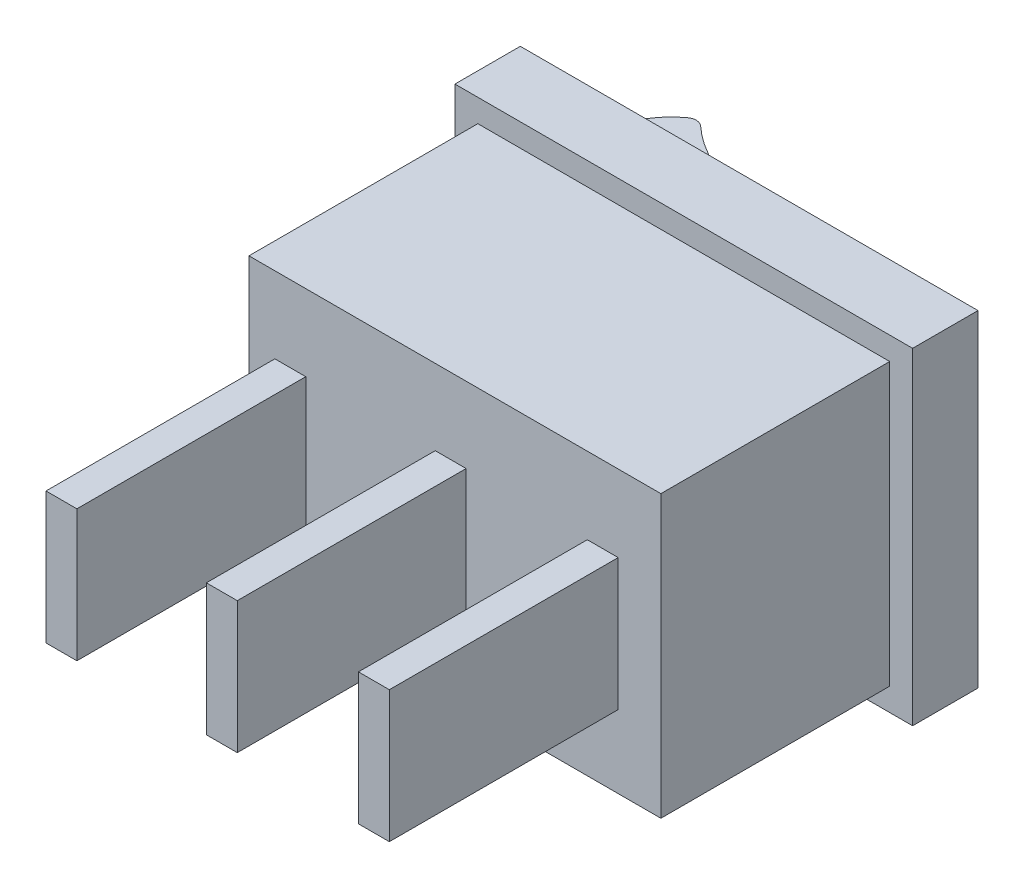
ISO-10303-21;
HEADER;
FILE_DESCRIPTION(('STEP AP214'),'2;1');
FILE_NAME('part.step','',(''),(''),'','','');
FILE_SCHEMA(('AUTOMOTIVE_DESIGN { 1 0 10303 214 1 1 1 1 }'));
ENDSEC;
DATA;
#1=APPLICATION_CONTEXT('core data for automotive mechanical design processes');
#2=APPLICATION_PROTOCOL_DEFINITION('international standard','automotive_design',2000,#1);
#3=PRODUCT_CONTEXT('',#1,'mechanical');
#4=PRODUCT('Part','Part','',(#3));
#5=PRODUCT_RELATED_PRODUCT_CATEGORY('part','',(#4));
#6=PRODUCT_DEFINITION_FORMATION('','',#4);
#7=PRODUCT_DEFINITION_CONTEXT('part definition',#1,'design');
#8=PRODUCT_DEFINITION('design','',#6,#7);
#9=PRODUCT_DEFINITION_SHAPE('','',#8);
#10=(LENGTH_UNIT() NAMED_UNIT(*) SI_UNIT(.MILLI.,.METRE.));
#11=(NAMED_UNIT(*) PLANE_ANGLE_UNIT() SI_UNIT($,.RADIAN.));
#12=(NAMED_UNIT(*) SI_UNIT($,.STERADIAN.) SOLID_ANGLE_UNIT());
#13=UNCERTAINTY_MEASURE_WITH_UNIT(LENGTH_MEASURE(1.E-05),#10,'distance_accuracy_value','');
#14=(GEOMETRIC_REPRESENTATION_CONTEXT(3) GLOBAL_UNCERTAINTY_ASSIGNED_CONTEXT((#13)) GLOBAL_UNIT_ASSIGNED_CONTEXT((#10,
#11,#12)) REPRESENTATION_CONTEXT('',''));
#15=CARTESIAN_POINT('',(0.,0.,0.));
#16=DIRECTION('',(0.,0.,1.));
#17=DIRECTION('',(1.,0.,0.));
#18=AXIS2_PLACEMENT_3D('',#15,#16,#17);
#19=CARTESIAN_POINT('',(0.,0.,13.5));
#20=DIRECTION('',(0.,0.,1.));
#21=DIRECTION('',(1.,0.,0.));
#22=AXIS2_PLACEMENT_3D('',#19,#20,#21);
#23=PLANE('',#22);
#24=DIRECTION('',(0.,1.,0.));
#25=VECTOR('',#24,1.);
#26=CARTESIAN_POINT('',(9.45,6.45,13.5));
#27=LINE('',#26,#25);
#28=CARTESIAN_POINT('',(9.45,-6.45,13.5));
#29=VERTEX_POINT('',#28);
#30=CARTESIAN_POINT('',(9.45,6.45,13.5));
#31=VERTEX_POINT('',#30);
#32=EDGE_CURVE('E420',#29,#31,#27,.T.);
#33=ORIENTED_EDGE('',*,*,#32,.T.);
#34=DIRECTION('',(-1.,0.,0.));
#35=VECTOR('',#34,1.);
#36=CARTESIAN_POINT('',(-9.45,6.45,13.5));
#37=LINE('',#36,#35);
#38=CARTESIAN_POINT('',(-9.45,6.45,13.5));
#39=VERTEX_POINT('',#38);
#40=EDGE_CURVE('E415',#31,#39,#37,.T.);
#41=ORIENTED_EDGE('',*,*,#40,.T.);
#42=DIRECTION('',(0.,-1.,0.));
#43=VECTOR('',#42,1.);
#44=CARTESIAN_POINT('',(-9.45,6.45,13.5));
#45=LINE('',#44,#43);
#46=CARTESIAN_POINT('',(-9.45,-6.45,13.5));
#47=VERTEX_POINT('',#46);
#48=EDGE_CURVE('E432',#39,#47,#45,.T.);
#49=ORIENTED_EDGE('',*,*,#48,.T.);
#50=DIRECTION('',(1.,0.,0.));
#51=VECTOR('',#50,1.);
#52=CARTESIAN_POINT('',(-9.45,-6.45,13.5));
#53=LINE('',#52,#51);
#54=EDGE_CURVE('E435',#47,#29,#53,.T.);
#55=ORIENTED_EDGE('',*,*,#54,.T.);
#56=EDGE_LOOP('',(#33,#41,#49,#55));
#57=FACE_BOUND('',#56,.T.);
#58=DIRECTION('',(1.,0.,0.));
#59=VECTOR('',#58,1.);
#60=CARTESIAN_POINT('',(-8.26175147034112,-3.08976071248527,13.5));
#61=LINE('',#60,#59);
#62=CARTESIAN_POINT('',(-8.26175147034112,-3.08976071248527,13.5));
#63=VERTEX_POINT('',#62);
#64=CARTESIAN_POINT('',(-6.84374534625367,-3.08976071248527,13.5));
#65=VERTEX_POINT('',#64);
#66=EDGE_CURVE('E264',#63,#65,#61,.T.);
#67=ORIENTED_EDGE('',*,*,#66,.F.);
#68=DIRECTION('',(0.,-1.,0.));
#69=VECTOR('',#68,1.);
#70=CARTESIAN_POINT('',(-8.26175147034112,2.95020930285563,13.5));
#71=LINE('',#70,#69);
#72=CARTESIAN_POINT('',(-8.26175147034112,2.95020930285563,13.5));
#73=VERTEX_POINT('',#72);
#74=EDGE_CURVE('E250',#73,#63,#71,.T.);
#75=ORIENTED_EDGE('',*,*,#74,.F.);
#76=DIRECTION('',(-1.,0.,0.));
#77=VECTOR('',#76,1.);
#78=CARTESIAN_POINT('',(-8.26175147034112,2.95020930285563,13.5));
#79=LINE('',#78,#77);
#80=CARTESIAN_POINT('',(-6.84374534625367,2.95020930285563,13.5));
#81=VERTEX_POINT('',#80);
#82=EDGE_CURVE('E255',#81,#73,#79,.T.);
#83=ORIENTED_EDGE('',*,*,#82,.F.);
#84=DIRECTION('',(0.,1.,0.));
#85=VECTOR('',#84,1.);
#86=CARTESIAN_POINT('',(-6.84374534625367,2.95020930285563,13.5));
#87=LINE('',#86,#85);
#88=EDGE_CURVE('E266',#65,#81,#87,.T.);
#89=ORIENTED_EDGE('',*,*,#88,.F.);
#90=EDGE_LOOP('',(#67,#75,#83,#89));
#91=FACE_BOUND('',#90,.T.);
#92=DIRECTION('',(1.,0.,0.));
#93=VECTOR('',#92,1.);
#94=CARTESIAN_POINT('',(-0.903046005339907,-3.05990795197817,13.5));
#95=LINE('',#94,#93);
#96=CARTESIAN_POINT('',(-0.903046005339907,-3.05990795197817,13.5));
#97=VERTEX_POINT('',#96);
#98=CARTESIAN_POINT('',(0.514960118747548,-3.05990795197817,13.5));
#99=VERTEX_POINT('',#98);
#100=EDGE_CURVE('E222',#97,#99,#95,.T.);
#101=ORIENTED_EDGE('',*,*,#100,.F.);
#102=DIRECTION('',(0.,-1.,0.));
#103=VECTOR('',#102,1.);
#104=CARTESIAN_POINT('',(-0.903046005339908,2.98006206336274,13.5));
#105=LINE('',#104,#103);
#106=CARTESIAN_POINT('',(-0.903046005339908,2.98006206336274,13.5));
#107=VERTEX_POINT('',#106);
#108=EDGE_CURVE('E219',#107,#97,#105,.T.);
#109=ORIENTED_EDGE('',*,*,#108,.F.);
#110=DIRECTION('',(-1.,0.,0.));
#111=VECTOR('',#110,1.);
#112=CARTESIAN_POINT('',(-0.903046005339908,2.98006206336274,13.5));
#113=LINE('',#112,#111);
#114=CARTESIAN_POINT('',(0.514960118747548,2.98006206336274,13.5));
#115=VERTEX_POINT('',#114);
#116=EDGE_CURVE('E231',#115,#107,#113,.T.);
#117=ORIENTED_EDGE('',*,*,#116,.F.);
#118=DIRECTION('',(0.,1.,0.));
#119=VECTOR('',#118,1.);
#120=CARTESIAN_POINT('',(0.514960118747548,2.98006206336274,13.5));
#121=LINE('',#120,#119);
#122=EDGE_CURVE('E239',#99,#115,#121,.T.);
#123=ORIENTED_EDGE('',*,*,#122,.F.);
#124=EDGE_LOOP('',(#101,#109,#117,#123));
#125=FACE_BOUND('',#124,.T.);
#126=DIRECTION('',(1.,0.,0.));
#127=VECTOR('',#126,1.);
#128=CARTESIAN_POINT('',(6.07376020752396,-3.10975909773958,13.5));
#129=LINE('',#128,#127);
#130=CARTESIAN_POINT('',(6.07376020752396,-3.10975909773958,13.5));
#131=VERTEX_POINT('',#130);
#132=CARTESIAN_POINT('',(7.49176633161142,-3.10975909773958,13.5));
#133=VERTEX_POINT('',#132);
#134=EDGE_CURVE('E479',#131,#133,#129,.T.);
#135=ORIENTED_EDGE('',*,*,#134,.F.);
#136=DIRECTION('',(0.,-1.,0.));
#137=VECTOR('',#136,1.);
#138=CARTESIAN_POINT('',(6.07376020752396,2.93021091760132,13.5));
#139=LINE('',#138,#137);
#140=CARTESIAN_POINT('',(6.07376020752396,2.93021091760132,13.5));
#141=VERTEX_POINT('',#140);
#142=EDGE_CURVE('E217',#141,#131,#139,.T.);
#143=ORIENTED_EDGE('',*,*,#142,.F.);
#144=DIRECTION('',(-1.,0.,0.));
#145=VECTOR('',#144,1.);
#146=CARTESIAN_POINT('',(6.07376020752396,2.93021091760132,13.5));
#147=LINE('',#146,#145);
#148=CARTESIAN_POINT('',(7.49176633161142,2.93021091760132,13.5));
#149=VERTEX_POINT('',#148);
#150=EDGE_CURVE('E213',#149,#141,#147,.T.);
#151=ORIENTED_EDGE('',*,*,#150,.F.);
#152=DIRECTION('',(0.,1.,0.));
#153=VECTOR('',#152,1.);
#154=CARTESIAN_POINT('',(7.49176633161142,2.93021091760132,13.5));
#155=LINE('',#154,#153);
#156=EDGE_CURVE('E481',#133,#149,#155,.T.);
#157=ORIENTED_EDGE('',*,*,#156,.F.);
#158=EDGE_LOOP('',(#135,#143,#151,#157));
#159=FACE_BOUND('',#158,.T.);
#160=ADVANCED_FACE('F33',(#57,#91,#125,#159),#23,.T.);
#161=CARTESIAN_POINT('',(10.5,7.5,13.5));
#162=DIRECTION('',(-1.,0.,0.));
#163=DIRECTION('',(0.,0.,1.));
#164=AXIS2_PLACEMENT_3D('',#161,#162,#163);
#165=PLANE('',#164);
#166=DIRECTION('',(0.,1.,0.));
#167=VECTOR('',#166,1.);
#168=CARTESIAN_POINT('',(10.5,7.5,3.));
#169=LINE('',#168,#167);
#170=CARTESIAN_POINT('',(10.5,-7.5,3.));
#171=VERTEX_POINT('',#170);
#172=CARTESIAN_POINT('',(10.5,7.5,3.));
#173=VERTEX_POINT('',#172);
#174=EDGE_CURVE('E348',#171,#173,#169,.T.);
#175=ORIENTED_EDGE('',*,*,#174,.F.);
#176=DIRECTION('',(0.,0.,-1.));
#177=VECTOR('',#176,1.);
#178=CARTESIAN_POINT('',(10.5,-7.5,13.5));
#179=LINE('',#178,#177);
#180=CARTESIAN_POINT('',(10.5,-7.5,0.));
#181=VERTEX_POINT('',#180);
#182=EDGE_CURVE('E351',#171,#181,#179,.T.);
#183=ORIENTED_EDGE('',*,*,#182,.T.);
#184=DIRECTION('',(0.,1.,0.));
#185=VECTOR('',#184,1.);
#186=CARTESIAN_POINT('',(10.5,7.5,0.));
#187=LINE('',#186,#185);
#188=CARTESIAN_POINT('',(10.5,7.5,0.));
#189=VERTEX_POINT('',#188);
#190=EDGE_CURVE('E452',#181,#189,#187,.T.);
#191=ORIENTED_EDGE('',*,*,#190,.T.);
#192=DIRECTION('',(0.,0.,-1.));
#193=VECTOR('',#192,1.);
#194=CARTESIAN_POINT('',(10.5,7.5,13.5));
#195=LINE('',#194,#193);
#196=EDGE_CURVE('E353',#173,#189,#195,.T.);
#197=ORIENTED_EDGE('',*,*,#196,.F.);
#198=EDGE_LOOP('',(#175,#183,#191,#197));
#199=FACE_BOUND('',#198,.T.);
#200=ADVANCED_FACE('F326',(#199),#165,.F.);
#201=CARTESIAN_POINT('',(-10.5,7.5,13.5));
#202=DIRECTION('',(0.,-1.,0.));
#203=DIRECTION('',(0.,0.,-1.));
#204=AXIS2_PLACEMENT_3D('',#201,#202,#203);
#205=PLANE('',#204);
#206=DIRECTION('',(-1.,0.,0.));
#207=VECTOR('',#206,1.);
#208=CARTESIAN_POINT('',(-10.5,7.5,3.));
#209=LINE('',#208,#207);
#210=CARTESIAN_POINT('',(-10.5,7.5,3.));
#211=VERTEX_POINT('',#210);
#212=EDGE_CURVE('E356',#173,#211,#209,.T.);
#213=ORIENTED_EDGE('',*,*,#212,.F.);
#214=ORIENTED_EDGE('',*,*,#196,.T.);
#215=DIRECTION('',(-1.,0.,0.));
#216=VECTOR('',#215,1.);
#217=CARTESIAN_POINT('',(-10.5,7.5,0.));
#218=LINE('',#217,#216);
#219=CARTESIAN_POINT('',(-10.5,7.5,0.));
#220=VERTEX_POINT('',#219);
#221=EDGE_CURVE('E454',#189,#220,#218,.T.);
#222=ORIENTED_EDGE('',*,*,#221,.T.);
#223=DIRECTION('',(0.,0.,-1.));
#224=VECTOR('',#223,1.);
#225=CARTESIAN_POINT('',(-10.5,7.5,13.5));
#226=LINE('',#225,#224);
#227=EDGE_CURVE('E366',#211,#220,#226,.T.);
#228=ORIENTED_EDGE('',*,*,#227,.F.);
#229=EDGE_LOOP('',(#213,#214,#222,#228));
#230=FACE_BOUND('',#229,.T.);
#231=ADVANCED_FACE('F338',(#230),#205,.F.);
#232=CARTESIAN_POINT('',(-10.5,7.5,13.5));
#233=DIRECTION('',(1.,0.,0.));
#234=DIRECTION('',(0.,0.,-1.));
#235=AXIS2_PLACEMENT_3D('',#232,#233,#234);
#236=PLANE('',#235);
#237=DIRECTION('',(0.,-1.,0.));
#238=VECTOR('',#237,1.);
#239=CARTESIAN_POINT('',(-10.5,7.5,3.));
#240=LINE('',#239,#238);
#241=CARTESIAN_POINT('',(-10.5,-7.5,3.));
#242=VERTEX_POINT('',#241);
#243=EDGE_CURVE('E442',#211,#242,#240,.T.);
#244=ORIENTED_EDGE('',*,*,#243,.F.);
#245=ORIENTED_EDGE('',*,*,#227,.T.);
#246=DIRECTION('',(0.,-1.,0.));
#247=VECTOR('',#246,1.);
#248=CARTESIAN_POINT('',(-10.5,7.5,0.));
#249=LINE('',#248,#247);
#250=CARTESIAN_POINT('',(-10.5,-7.5,0.));
#251=VERTEX_POINT('',#250);
#252=EDGE_CURVE('E368',#220,#251,#249,.T.);
#253=ORIENTED_EDGE('',*,*,#252,.T.);
#254=DIRECTION('',(0.,0.,-1.));
#255=VECTOR('',#254,1.);
#256=CARTESIAN_POINT('',(-10.5,-7.5,13.5));
#257=LINE('',#256,#255);
#258=EDGE_CURVE('E364',#242,#251,#257,.T.);
#259=ORIENTED_EDGE('',*,*,#258,.F.);
#260=EDGE_LOOP('',(#244,#245,#253,#259));
#261=FACE_BOUND('',#260,.T.);
#262=ADVANCED_FACE('F334',(#261),#236,.F.);
#263=CARTESIAN_POINT('',(-10.5,-7.5,13.5));
#264=DIRECTION('',(0.,1.,0.));
#265=DIRECTION('',(0.,0.,1.));
#266=AXIS2_PLACEMENT_3D('',#263,#264,#265);
#267=PLANE('',#266);
#268=DIRECTION('',(1.,0.,0.));
#269=VECTOR('',#268,1.);
#270=CARTESIAN_POINT('',(-10.5,-7.5,3.));
#271=LINE('',#270,#269);
#272=EDGE_CURVE('E357',#242,#171,#271,.T.);
#273=ORIENTED_EDGE('',*,*,#272,.F.);
#274=ORIENTED_EDGE('',*,*,#258,.T.);
#275=DIRECTION('',(1.,0.,0.));
#276=VECTOR('',#275,1.);
#277=CARTESIAN_POINT('',(-10.5,-7.5,0.));
#278=LINE('',#277,#276);
#279=EDGE_CURVE('E362',#251,#181,#278,.T.);
#280=ORIENTED_EDGE('',*,*,#279,.T.);
#281=ORIENTED_EDGE('',*,*,#182,.F.);
#282=EDGE_LOOP('',(#273,#274,#280,#281));
#283=FACE_BOUND('',#282,.T.);
#284=ADVANCED_FACE('F330',(#283),#267,.F.);
#285=CARTESIAN_POINT('',(0.,0.,0.));
#286=DIRECTION('',(0.,0.,1.));
#287=DIRECTION('',(1.,0.,0.));
#288=AXIS2_PLACEMENT_3D('',#285,#286,#287);
#289=PLANE('',#288);
#290=DIRECTION('',(0.,-1.,0.));
#291=VECTOR('',#290,1.);
#292=CARTESIAN_POINT('',(-7.96352239287512,5.25,0.));
#293=LINE('',#292,#291);
#294=CARTESIAN_POINT('',(-7.96352239287512,5.25,0.));
#295=VERTEX_POINT('',#294);
#296=CARTESIAN_POINT('',(-7.96352239287512,-5.25,0.));
#297=VERTEX_POINT('',#296);
#298=EDGE_CURVE('E413',#295,#297,#293,.T.);
#299=ORIENTED_EDGE('',*,*,#298,.T.);
#300=DIRECTION('',(1.,0.,0.));
#301=VECTOR('',#300,1.);
#302=CARTESIAN_POINT('',(7.03928092757528,-5.25,0.));
#303=LINE('',#302,#301);
#304=CARTESIAN_POINT('',(7.03928092757528,-5.25,0.));
#305=VERTEX_POINT('',#304);
#306=EDGE_CURVE('E287',#297,#305,#303,.T.);
#307=ORIENTED_EDGE('',*,*,#306,.T.);
#308=DIRECTION('',(0.,-1.,0.));
#309=VECTOR('',#308,1.);
#310=CARTESIAN_POINT('',(7.03928092757528,5.25,0.));
#311=LINE('',#310,#309);
#312=CARTESIAN_POINT('',(7.03928092757528,5.25,0.));
#313=VERTEX_POINT('',#312);
#314=EDGE_CURVE('E411',#313,#305,#311,.T.);
#315=ORIENTED_EDGE('',*,*,#314,.F.);
#316=DIRECTION('',(1.,0.,0.));
#317=VECTOR('',#316,1.);
#318=CARTESIAN_POINT('',(7.03928092757528,5.25,0.));
#319=LINE('',#318,#317);
#320=EDGE_CURVE('E389',#295,#313,#319,.T.);
#321=ORIENTED_EDGE('',*,*,#320,.F.);
#322=EDGE_LOOP('',(#299,#307,#315,#321));
#323=FACE_BOUND('',#322,.T.);
#324=ORIENTED_EDGE('',*,*,#190,.F.);
#325=ORIENTED_EDGE('',*,*,#279,.F.);
#326=ORIENTED_EDGE('',*,*,#252,.F.);
#327=ORIENTED_EDGE('',*,*,#221,.F.);
#328=EDGE_LOOP('',(#324,#325,#326,#327));
#329=FACE_BOUND('',#328,.T.);
#330=ADVANCED_FACE('F322',(#323,#329),#289,.F.);
#331=CARTESIAN_POINT('',(0.,0.,3.));
#332=DIRECTION('',(0.,0.,1.));
#333=DIRECTION('',(1.,0.,0.));
#334=AXIS2_PLACEMENT_3D('',#331,#332,#333);
#335=PLANE('',#334);
#336=DIRECTION('',(0.,1.,0.));
#337=VECTOR('',#336,1.);
#338=CARTESIAN_POINT('',(9.45,6.45,3.));
#339=LINE('',#338,#337);
#340=CARTESIAN_POINT('',(9.45,-6.45,3.));
#341=VERTEX_POINT('',#340);
#342=CARTESIAN_POINT('',(9.45,6.45,3.));
#343=VERTEX_POINT('',#342);
#344=EDGE_CURVE('E426',#341,#343,#339,.T.);
#345=ORIENTED_EDGE('',*,*,#344,.F.);
#346=DIRECTION('',(1.,0.,0.));
#347=VECTOR('',#346,1.);
#348=CARTESIAN_POINT('',(-9.45,-6.45,3.));
#349=LINE('',#348,#347);
#350=CARTESIAN_POINT('',(-9.45,-6.45,3.));
#351=VERTEX_POINT('',#350);
#352=EDGE_CURVE('E423',#351,#341,#349,.T.);
#353=ORIENTED_EDGE('',*,*,#352,.F.);
#354=DIRECTION('',(0.,-1.,0.));
#355=VECTOR('',#354,1.);
#356=CARTESIAN_POINT('',(-9.45,6.45,3.));
#357=LINE('',#356,#355);
#358=CARTESIAN_POINT('',(-9.45,6.45,3.));
#359=VERTEX_POINT('',#358);
#360=EDGE_CURVE('E419',#359,#351,#357,.T.);
#361=ORIENTED_EDGE('',*,*,#360,.F.);
#362=DIRECTION('',(-1.,0.,0.));
#363=VECTOR('',#362,1.);
#364=CARTESIAN_POINT('',(-9.45,6.45,3.));
#365=LINE('',#364,#363);
#366=EDGE_CURVE('E416',#343,#359,#365,.T.);
#367=ORIENTED_EDGE('',*,*,#366,.F.);
#368=EDGE_LOOP('',(#345,#353,#361,#367));
#369=FACE_BOUND('',#368,.T.);
#370=ORIENTED_EDGE('',*,*,#243,.T.);
#371=ORIENTED_EDGE('',*,*,#272,.T.);
#372=ORIENTED_EDGE('',*,*,#174,.T.);
#373=ORIENTED_EDGE('',*,*,#212,.T.);
#374=EDGE_LOOP('',(#370,#371,#372,#373));
#375=FACE_BOUND('',#374,.T.);
#376=ADVANCED_FACE('F318',(#369,#375),#335,.T.);
#377=CARTESIAN_POINT('',(-9.45,6.45,3.));
#378=DIRECTION('',(0.,1.,0.));
#379=DIRECTION('',(0.,0.,1.));
#380=AXIS2_PLACEMENT_3D('',#377,#378,#379);
#381=PLANE('',#380);
#382=ORIENTED_EDGE('',*,*,#40,.F.);
#383=DIRECTION('',(0.,0.,1.));
#384=VECTOR('',#383,1.);
#385=CARTESIAN_POINT('',(9.45,6.45,3.));
#386=LINE('',#385,#384);
#387=EDGE_CURVE('E440',#343,#31,#386,.T.);
#388=ORIENTED_EDGE('',*,*,#387,.F.);
#389=ORIENTED_EDGE('',*,*,#366,.T.);
#390=DIRECTION('',(0.,0.,1.));
#391=VECTOR('',#390,1.);
#392=CARTESIAN_POINT('',(-9.45,6.45,3.));
#393=LINE('',#392,#391);
#394=EDGE_CURVE('E429',#359,#39,#393,.T.);
#395=ORIENTED_EDGE('',*,*,#394,.T.);
#396=EDGE_LOOP('',(#382,#388,#389,#395));
#397=FACE_BOUND('',#396,.T.);
#398=ADVANCED_FACE('F308',(#397),#381,.T.);
#399=CARTESIAN_POINT('',(9.45,6.45,3.));
#400=DIRECTION('',(1.,0.,0.));
#401=DIRECTION('',(0.,0.,-1.));
#402=AXIS2_PLACEMENT_3D('',#399,#400,#401);
#403=PLANE('',#402);
#404=ORIENTED_EDGE('',*,*,#32,.F.);
#405=DIRECTION('',(0.,0.,1.));
#406=VECTOR('',#405,1.);
#407=CARTESIAN_POINT('',(9.45,-6.45,3.));
#408=LINE('',#407,#406);
#409=EDGE_CURVE('E443',#341,#29,#408,.T.);
#410=ORIENTED_EDGE('',*,*,#409,.F.);
#411=ORIENTED_EDGE('',*,*,#344,.T.);
#412=ORIENTED_EDGE('',*,*,#387,.T.);
#413=EDGE_LOOP('',(#404,#410,#411,#412));
#414=FACE_BOUND('',#413,.T.);
#415=ADVANCED_FACE('F304',(#414),#403,.T.);
#416=CARTESIAN_POINT('',(-9.45,-6.45,3.));
#417=DIRECTION('',(0.,-1.,0.));
#418=DIRECTION('',(0.,0.,-1.));
#419=AXIS2_PLACEMENT_3D('',#416,#417,#418);
#420=PLANE('',#419);
#421=ORIENTED_EDGE('',*,*,#54,.F.);
#422=DIRECTION('',(0.,0.,1.));
#423=VECTOR('',#422,1.);
#424=CARTESIAN_POINT('',(-9.45,-6.45,3.));
#425=LINE('',#424,#423);
#426=EDGE_CURVE('E445',#351,#47,#425,.T.);
#427=ORIENTED_EDGE('',*,*,#426,.F.);
#428=ORIENTED_EDGE('',*,*,#352,.T.);
#429=ORIENTED_EDGE('',*,*,#409,.T.);
#430=EDGE_LOOP('',(#421,#427,#428,#429));
#431=FACE_BOUND('',#430,.T.);
#432=ADVANCED_FACE('F307',(#431),#420,.T.);
#433=CARTESIAN_POINT('',(-9.45,6.45,3.));
#434=DIRECTION('',(-1.,0.,0.));
#435=DIRECTION('',(0.,0.,1.));
#436=AXIS2_PLACEMENT_3D('',#433,#434,#435);
#437=PLANE('',#436);
#438=ORIENTED_EDGE('',*,*,#48,.F.);
#439=ORIENTED_EDGE('',*,*,#394,.F.);
#440=ORIENTED_EDGE('',*,*,#360,.T.);
#441=ORIENTED_EDGE('',*,*,#426,.T.);
#442=EDGE_LOOP('',(#438,#439,#440,#441));
#443=FACE_BOUND('',#442,.T.);
#444=ADVANCED_FACE('F301',(#443),#437,.T.);
#445=CARTESIAN_POINT('',(7.03928092757528,5.25,0.));
#446=CARTESIAN_POINT('',(4.22402006114333,5.25,-0.0692176151443661));
#447=CARTESIAN_POINT('',(-0.214677684163908,5.25,-0.666830620425082));
#448=CARTESIAN_POINT('',(-4.50292106901317,5.25,-2.20467774432923));
#449=CARTESIAN_POINT('',(-5.70665369853801,5.25,-3.48113808099488));
#450=B_SPLINE_CURVE_WITH_KNOTS('',3,(#445,#446,#447,#448,#449),.UNSPECIFIED.,.F.,.F.,(4,1,4),
(0.,0.624058329896572,1.),.UNSPECIFIED.);
#451=DIRECTION('',(0.,-1.,0.));
#452=VECTOR('',#451,1.);
#453=SURFACE_OF_LINEAR_EXTRUSION('',#450,#452);
#454=CARTESIAN_POINT('',(7.03928092757528,-5.25,0.));
#455=CARTESIAN_POINT('',(4.22402006114333,-5.25,-0.0692176151443661));
#456=CARTESIAN_POINT('',(-0.214677684163908,-5.25,-0.666830620425082));
#457=CARTESIAN_POINT('',(-4.50292106901317,-5.25,-2.20467774432923));
#458=CARTESIAN_POINT('',(-5.70665369853801,-5.25,-3.48113808099488));
#459=B_SPLINE_CURVE_WITH_KNOTS('',3,(#454,#455,#456,#457,#458),.UNSPECIFIED.,.F.,.F.,(4,1,4),
(0.,0.624058329896572,1.),.UNSPECIFIED.);
#460=CARTESIAN_POINT('',(-5.43822065057914,-5.25,-3.21399688626997));
#461=VERTEX_POINT('',#460);
#462=EDGE_CURVE('E279',#305,#461,#459,.T.);
#463=ORIENTED_EDGE('',*,*,#462,.T.);
#464=DIRECTION('',(0.,-1.,0.));
#465=VECTOR('',#464,1.);
#466=CARTESIAN_POINT('',(-5.43822065057797,-5.25,-3.21399688626887));
#467=LINE('',#466,#465);
#468=CARTESIAN_POINT('',(-5.43822065057914,5.25,-3.21399688626997));
#469=VERTEX_POINT('',#468);
#470=EDGE_CURVE('E41',#461,#469,#467,.F.);
#471=ORIENTED_EDGE('',*,*,#470,.T.);
#472=EDGE_CURVE('E280',#313,#469,#450,.T.);
#473=ORIENTED_EDGE('',*,*,#472,.F.);
#474=ORIENTED_EDGE('',*,*,#314,.T.);
#475=EDGE_LOOP('',(#463,#471,#473,#474));
#476=FACE_BOUND('',#475,.T.);
#477=ADVANCED_FACE('F296',(#476),#453,.F.);
#478=CARTESIAN_POINT('',(-5.70665369853801,5.25,-3.48113808099488));
#479=CARTESIAN_POINT('',(-7.05794291166516,5.25,-2.76318769823294));
#480=CARTESIAN_POINT('',(-7.48846721714369,5.25,-1.30741620410435));
#481=CARTESIAN_POINT('',(-7.96352239287512,5.25,0.));
#482=B_SPLINE_CURVE_WITH_KNOTS('',3,(#478,#479,#480,#481),.UNSPECIFIED.,.F.,.F.,(4,4),(0.,1.),.UNSPECIFIED.);
#483=DIRECTION('',(0.,-1.,0.));
#484=VECTOR('',#483,1.);
#485=SURFACE_OF_LINEAR_EXTRUSION('',#482,#484);
#486=CARTESIAN_POINT('',(-6.07164005568649,5.25,-3.25445208079002));
#487=VERTEX_POINT('',#486);
#488=EDGE_CURVE('E286',#487,#295,#482,.T.);
#489=ORIENTED_EDGE('',*,*,#488,.F.);
#490=DIRECTION('',(0.,-1.,0.));
#491=VECTOR('',#490,1.);
#492=CARTESIAN_POINT('',(-6.07164005568649,5.25,-3.25445208079002));
#493=LINE('',#492,#491);
#494=CARTESIAN_POINT('',(-6.07164005568649,-5.25,-3.25445208079002));
#495=VERTEX_POINT('',#494);
#496=EDGE_CURVE('E374',#487,#495,#493,.T.);
#497=ORIENTED_EDGE('',*,*,#496,.T.);
#498=CARTESIAN_POINT('',(-5.70665369853801,-5.25,-3.48113808099488));
#499=CARTESIAN_POINT('',(-7.05794291166516,-5.25,-2.76318769823294));
#500=CARTESIAN_POINT('',(-7.48846721714369,-5.25,-1.30741620410435));
#501=CARTESIAN_POINT('',(-7.96352239287512,-5.25,0.));
#502=B_SPLINE_CURVE_WITH_KNOTS('',3,(#498,#499,#500,#501),.UNSPECIFIED.,.F.,.F.,(4,4),(0.,1.),.UNSPECIFIED.);
#503=EDGE_CURVE('E394',#495,#297,#502,.T.);
#504=ORIENTED_EDGE('',*,*,#503,.T.);
#505=ORIENTED_EDGE('',*,*,#298,.F.);
#506=EDGE_LOOP('',(#489,#497,#504,#505));
#507=FACE_BOUND('',#506,.T.);
#508=ADVANCED_FACE('F300',(#507),#485,.F.);
#509=CARTESIAN_POINT('',(0.366471543100387,5.25,-0.783408414690507));
#510=DIRECTION('',(0.,1.,0.));
#511=DIRECTION('',(0.,0.,1.));
#512=AXIS2_PLACEMENT_3D('',#509,#510,#511);
#513=PLANE('',#512);
#514=ORIENTED_EDGE('',*,*,#472,.T.);
#515=CARTESIAN_POINT('',(-5.77955716685518,5.25,-2.84863489774825));
#516=DIRECTION('',(0.,1.,0.));
#517=DIRECTION('',(0.,0.,1.));
#518=AXIS2_PLACEMENT_3D('',#515,#516,#517);
#519=CIRCLE('',#518,0.5);
#520=EDGE_CURVE('E11',#469,#487,#519,.T.);
#521=ORIENTED_EDGE('',*,*,#520,.T.);
#522=ORIENTED_EDGE('',*,*,#488,.T.);
#523=ORIENTED_EDGE('',*,*,#320,.T.);
#524=EDGE_LOOP('',(#514,#521,#522,#523));
#525=FACE_BOUND('',#524,.T.);
#526=ADVANCED_FACE('F386',(#525),#513,.T.);
#527=CARTESIAN_POINT('',(0.366471543100387,-5.25,-0.783408414690507));
#528=DIRECTION('',(0.,1.,0.));
#529=DIRECTION('',(0.,0.,1.));
#530=AXIS2_PLACEMENT_3D('',#527,#528,#529);
#531=PLANE('',#530);
#532=ORIENTED_EDGE('',*,*,#503,.F.);
#533=CARTESIAN_POINT('',(-5.77955716685518,-5.25,-2.84863489774825));
#534=DIRECTION('',(0.,1.,0.));
#535=DIRECTION('',(0.,0.,1.));
#536=AXIS2_PLACEMENT_3D('',#533,#534,#535);
#537=CIRCLE('',#536,0.5);
#538=EDGE_CURVE('E377',#495,#461,#537,.F.);
#539=ORIENTED_EDGE('',*,*,#538,.T.);
#540=ORIENTED_EDGE('',*,*,#462,.F.);
#541=ORIENTED_EDGE('',*,*,#306,.F.);
#542=EDGE_LOOP('',(#532,#539,#540,#541));
#543=FACE_BOUND('',#542,.T.);
#544=ADVANCED_FACE('F397',(#543),#531,.F.);
#545=CARTESIAN_POINT('',(-5.77955716685518,0.,-2.84863489774825));
#546=DIRECTION('',(0.,-1.,0.));
#547=DIRECTION('',(0.,0.,-1.));
#548=AXIS2_PLACEMENT_3D('',#545,#546,#547);
#549=CYLINDRICAL_SURFACE('',#548,0.5);
#550=ORIENTED_EDGE('',*,*,#520,.F.);
#551=ORIENTED_EDGE('',*,*,#470,.F.);
#552=ORIENTED_EDGE('',*,*,#538,.F.);
#553=ORIENTED_EDGE('',*,*,#496,.F.);
#554=EDGE_LOOP('',(#550,#551,#552,#553));
#555=FACE_BOUND('',#554,.T.);
#556=ADVANCED_FACE('F35',(#555),#549,.T.);
#557=CARTESIAN_POINT('',(-8.26175147034112,2.95020930285563,24.));
#558=DIRECTION('',(1.,0.,0.));
#559=DIRECTION('',(0.,0.,-1.));
#560=AXIS2_PLACEMENT_3D('',#557,#558,#559);
#561=PLANE('',#560);
#562=ORIENTED_EDGE('',*,*,#74,.T.);
#563=DIRECTION('',(0.,0.,-1.));
#564=VECTOR('',#563,1.);
#565=CARTESIAN_POINT('',(-8.26175147034112,-3.08976071248527,24.));
#566=LINE('',#565,#564);
#567=CARTESIAN_POINT('',(-8.26175147034112,-3.08976071248527,24.));
#568=VERTEX_POINT('',#567);
#569=EDGE_CURVE('E277',#568,#63,#566,.T.);
#570=ORIENTED_EDGE('',*,*,#569,.F.);
#571=DIRECTION('',(0.,-1.,0.));
#572=VECTOR('',#571,1.);
#573=CARTESIAN_POINT('',(-8.26175147034112,2.95020930285563,24.));
#574=LINE('',#573,#572);
#575=CARTESIAN_POINT('',(-8.26175147034112,2.95020930285563,24.));
#576=VERTEX_POINT('',#575);
#577=EDGE_CURVE('E251',#576,#568,#574,.T.);
#578=ORIENTED_EDGE('',*,*,#577,.F.);
#579=DIRECTION('',(0.,0.,-1.));
#580=VECTOR('',#579,1.);
#581=CARTESIAN_POINT('',(-8.26175147034112,2.95020930285563,24.));
#582=LINE('',#581,#580);
#583=EDGE_CURVE('E261',#576,#73,#582,.T.);
#584=ORIENTED_EDGE('',*,*,#583,.T.);
#585=EDGE_LOOP('',(#562,#570,#578,#584));
#586=FACE_BOUND('',#585,.T.);
#587=ADVANCED_FACE('F540',(#586),#561,.F.);
#588=CARTESIAN_POINT('',(-8.26175147034112,-3.08976071248527,24.));
#589=DIRECTION('',(0.,1.,0.));
#590=DIRECTION('',(0.,0.,1.));
#591=AXIS2_PLACEMENT_3D('',#588,#589,#590);
#592=PLANE('',#591);
#593=ORIENTED_EDGE('',*,*,#66,.T.);
#594=DIRECTION('',(0.,0.,-1.));
#595=VECTOR('',#594,1.);
#596=CARTESIAN_POINT('',(-6.84374534625367,-3.08976071248527,24.));
#597=LINE('',#596,#595);
#598=CARTESIAN_POINT('',(-6.84374534625367,-3.08976071248527,24.));
#599=VERTEX_POINT('',#598);
#600=EDGE_CURVE('E274',#599,#65,#597,.T.);
#601=ORIENTED_EDGE('',*,*,#600,.F.);
#602=DIRECTION('',(1.,0.,0.));
#603=VECTOR('',#602,1.);
#604=CARTESIAN_POINT('',(-8.26175147034112,-3.08976071248527,24.));
#605=LINE('',#604,#603);
#606=EDGE_CURVE('E254',#568,#599,#605,.T.);
#607=ORIENTED_EDGE('',*,*,#606,.F.);
#608=ORIENTED_EDGE('',*,*,#569,.T.);
#609=EDGE_LOOP('',(#593,#601,#607,#608));
#610=FACE_BOUND('',#609,.T.);
#611=ADVANCED_FACE('F536',(#610),#592,.F.);
#612=CARTESIAN_POINT('',(-6.84374534625367,2.95020930285563,24.));
#613=DIRECTION('',(-1.,0.,0.));
#614=DIRECTION('',(0.,0.,1.));
#615=AXIS2_PLACEMENT_3D('',#612,#613,#614);
#616=PLANE('',#615);
#617=ORIENTED_EDGE('',*,*,#88,.T.);
#618=DIRECTION('',(0.,0.,-1.));
#619=VECTOR('',#618,1.);
#620=CARTESIAN_POINT('',(-6.84374534625367,2.95020930285563,24.));
#621=LINE('',#620,#619);
#622=CARTESIAN_POINT('',(-6.84374534625367,2.95020930285563,24.));
#623=VERTEX_POINT('',#622);
#624=EDGE_CURVE('E272',#623,#81,#621,.T.);
#625=ORIENTED_EDGE('',*,*,#624,.F.);
#626=DIRECTION('',(0.,1.,0.));
#627=VECTOR('',#626,1.);
#628=CARTESIAN_POINT('',(-6.84374534625367,2.95020930285563,24.));
#629=LINE('',#628,#627);
#630=EDGE_CURVE('E257',#599,#623,#629,.T.);
#631=ORIENTED_EDGE('',*,*,#630,.F.);
#632=ORIENTED_EDGE('',*,*,#600,.T.);
#633=EDGE_LOOP('',(#617,#625,#631,#632));
#634=FACE_BOUND('',#633,.T.);
#635=ADVANCED_FACE('F532',(#634),#616,.F.);
#636=CARTESIAN_POINT('',(-8.26175147034112,2.95020930285563,24.));
#637=DIRECTION('',(0.,-1.,0.));
#638=DIRECTION('',(0.,0.,-1.));
#639=AXIS2_PLACEMENT_3D('',#636,#637,#638);
#640=PLANE('',#639);
#641=ORIENTED_EDGE('',*,*,#82,.T.);
#642=ORIENTED_EDGE('',*,*,#583,.F.);
#643=DIRECTION('',(-1.,0.,0.));
#644=VECTOR('',#643,1.);
#645=CARTESIAN_POINT('',(-8.26175147034112,2.95020930285563,24.));
#646=LINE('',#645,#644);
#647=EDGE_CURVE('E259',#623,#576,#646,.T.);
#648=ORIENTED_EDGE('',*,*,#647,.F.);
#649=ORIENTED_EDGE('',*,*,#624,.T.);
#650=EDGE_LOOP('',(#641,#642,#648,#649));
#651=FACE_BOUND('',#650,.T.);
#652=ADVANCED_FACE('F528',(#651),#640,.F.);
#653=CARTESIAN_POINT('',(0.,0.,24.));
#654=DIRECTION('',(0.,0.,1.));
#655=DIRECTION('',(1.,0.,0.));
#656=AXIS2_PLACEMENT_3D('',#653,#654,#655);
#657=PLANE('',#656);
#658=ORIENTED_EDGE('',*,*,#577,.T.);
#659=ORIENTED_EDGE('',*,*,#606,.T.);
#660=ORIENTED_EDGE('',*,*,#630,.T.);
#661=ORIENTED_EDGE('',*,*,#647,.T.);
#662=EDGE_LOOP('',(#658,#659,#660,#661));
#663=FACE_BOUND('',#662,.T.);
#664=ADVANCED_FACE('F524',(#663),#657,.T.);
#665=CARTESIAN_POINT('',(-0.903046005339908,2.98006206336274,24.));
#666=DIRECTION('',(1.,0.,0.));
#667=DIRECTION('',(0.,1.,0.));
#668=AXIS2_PLACEMENT_3D('',#665,#666,#667);
#669=PLANE('',#668);
#670=ORIENTED_EDGE('',*,*,#108,.T.);
#671=DIRECTION('',(0.,0.,-1.));
#672=VECTOR('',#671,1.);
#673=CARTESIAN_POINT('',(-0.903046005339907,-3.05990795197817,24.));
#674=LINE('',#673,#672);
#675=CARTESIAN_POINT('',(-0.903046005339907,-3.05990795197817,24.));
#676=VERTEX_POINT('',#675);
#677=EDGE_CURVE('E248',#676,#97,#674,.T.);
#678=ORIENTED_EDGE('',*,*,#677,.F.);
#679=DIRECTION('',(0.,-1.,0.));
#680=VECTOR('',#679,1.);
#681=CARTESIAN_POINT('',(-0.903046005339908,2.98006206336274,24.));
#682=LINE('',#681,#680);
#683=CARTESIAN_POINT('',(-0.903046005339908,2.98006206336274,24.));
#684=VERTEX_POINT('',#683);
#685=EDGE_CURVE('E227',#684,#676,#682,.T.);
#686=ORIENTED_EDGE('',*,*,#685,.F.);
#687=DIRECTION('',(0.,0.,-1.));
#688=VECTOR('',#687,1.);
#689=CARTESIAN_POINT('',(-0.903046005339908,2.98006206336274,24.));
#690=LINE('',#689,#688);
#691=EDGE_CURVE('E236',#684,#107,#690,.T.);
#692=ORIENTED_EDGE('',*,*,#691,.T.);
#693=EDGE_LOOP('',(#670,#678,#686,#692));
#694=FACE_BOUND('',#693,.T.);
#695=ADVANCED_FACE('F520',(#694),#669,.F.);
#696=CARTESIAN_POINT('',(-0.903046005339907,-3.05990795197817,24.));
#697=DIRECTION('',(0.,1.,0.));
#698=DIRECTION('',(0.,0.,1.));
#699=AXIS2_PLACEMENT_3D('',#696,#697,#698);
#700=PLANE('',#699);
#701=ORIENTED_EDGE('',*,*,#100,.T.);
#702=DIRECTION('',(0.,0.,-1.));
#703=VECTOR('',#702,1.);
#704=CARTESIAN_POINT('',(0.514960118747548,-3.05990795197817,24.));
#705=LINE('',#704,#703);
#706=CARTESIAN_POINT('',(0.514960118747548,-3.05990795197817,24.));
#707=VERTEX_POINT('',#706);
#708=EDGE_CURVE('E245',#707,#99,#705,.T.);
#709=ORIENTED_EDGE('',*,*,#708,.F.);
#710=DIRECTION('',(1.,0.,0.));
#711=VECTOR('',#710,1.);
#712=CARTESIAN_POINT('',(-0.903046005339907,-3.05990795197817,24.));
#713=LINE('',#712,#711);
#714=EDGE_CURVE('E230',#676,#707,#713,.T.);
#715=ORIENTED_EDGE('',*,*,#714,.F.);
#716=ORIENTED_EDGE('',*,*,#677,.T.);
#717=EDGE_LOOP('',(#701,#709,#715,#716));
#718=FACE_BOUND('',#717,.T.);
#719=ADVANCED_FACE('F516',(#718),#700,.F.);
#720=CARTESIAN_POINT('',(0.514960118747548,2.98006206336274,24.));
#721=DIRECTION('',(-1.,0.,0.));
#722=DIRECTION('',(0.,-1.,0.));
#723=AXIS2_PLACEMENT_3D('',#720,#721,#722);
#724=PLANE('',#723);
#725=ORIENTED_EDGE('',*,*,#122,.T.);
#726=DIRECTION('',(0.,0.,-1.));
#727=VECTOR('',#726,1.);
#728=CARTESIAN_POINT('',(0.514960118747548,2.98006206336274,24.));
#729=LINE('',#728,#727);
#730=CARTESIAN_POINT('',(0.514960118747548,2.98006206336274,24.));
#731=VERTEX_POINT('',#730);
#732=EDGE_CURVE('E56',#731,#115,#729,.T.);
#733=ORIENTED_EDGE('',*,*,#732,.F.);
#734=DIRECTION('',(0.,1.,0.));
#735=VECTOR('',#734,1.);
#736=CARTESIAN_POINT('',(0.514960118747548,2.98006206336274,24.));
#737=LINE('',#736,#735);
#738=EDGE_CURVE('E233',#707,#731,#737,.T.);
#739=ORIENTED_EDGE('',*,*,#738,.F.);
#740=ORIENTED_EDGE('',*,*,#708,.T.);
#741=EDGE_LOOP('',(#725,#733,#739,#740));
#742=FACE_BOUND('',#741,.T.);
#743=ADVANCED_FACE('F513',(#742),#724,.F.);
#744=CARTESIAN_POINT('',(-0.903046005339908,2.98006206336274,24.));
#745=DIRECTION('',(0.,-1.,0.));
#746=DIRECTION('',(0.,0.,-1.));
#747=AXIS2_PLACEMENT_3D('',#744,#745,#746);
#748=PLANE('',#747);
#749=ORIENTED_EDGE('',*,*,#116,.T.);
#750=ORIENTED_EDGE('',*,*,#691,.F.);
#751=DIRECTION('',(-1.,0.,0.));
#752=VECTOR('',#751,1.);
#753=CARTESIAN_POINT('',(-0.903046005339908,2.98006206336274,24.));
#754=LINE('',#753,#752);
#755=EDGE_CURVE('E235',#731,#684,#754,.T.);
#756=ORIENTED_EDGE('',*,*,#755,.F.);
#757=ORIENTED_EDGE('',*,*,#732,.T.);
#758=EDGE_LOOP('',(#749,#750,#756,#757));
#759=FACE_BOUND('',#758,.T.);
#760=ADVANCED_FACE('F509',(#759),#748,.F.);
#761=CARTESIAN_POINT('',(0.,0.,24.));
#762=DIRECTION('',(0.,0.,1.));
#763=DIRECTION('',(1.,0.,0.));
#764=AXIS2_PLACEMENT_3D('',#761,#762,#763);
#765=PLANE('',#764);
#766=ORIENTED_EDGE('',*,*,#685,.T.);
#767=ORIENTED_EDGE('',*,*,#714,.T.);
#768=ORIENTED_EDGE('',*,*,#738,.T.);
#769=ORIENTED_EDGE('',*,*,#755,.T.);
#770=EDGE_LOOP('',(#766,#767,#768,#769));
#771=FACE_BOUND('',#770,.T.);
#772=ADVANCED_FACE('F506',(#771),#765,.T.);
#773=CARTESIAN_POINT('',(6.07376020752396,2.93021091760132,24.));
#774=DIRECTION('',(1.,0.,0.));
#775=DIRECTION('',(0.,0.,-1.));
#776=AXIS2_PLACEMENT_3D('',#773,#774,#775);
#777=PLANE('',#776);
#778=ORIENTED_EDGE('',*,*,#142,.T.);
#779=DIRECTION('',(0.,0.,-1.));
#780=VECTOR('',#779,1.);
#781=CARTESIAN_POINT('',(6.07376020752396,-3.10975909773958,24.));
#782=LINE('',#781,#780);
#783=CARTESIAN_POINT('',(6.07376020752396,-3.10975909773958,24.));
#784=VERTEX_POINT('',#783);
#785=EDGE_CURVE('E198',#784,#131,#782,.T.);
#786=ORIENTED_EDGE('',*,*,#785,.F.);
#787=DIRECTION('',(0.,-1.,0.));
#788=VECTOR('',#787,1.);
#789=CARTESIAN_POINT('',(6.07376020752396,2.93021091760132,24.));
#790=LINE('',#789,#788);
#791=CARTESIAN_POINT('',(6.07376020752396,2.93021091760132,24.));
#792=VERTEX_POINT('',#791);
#793=EDGE_CURVE('E205',#792,#784,#790,.T.);
#794=ORIENTED_EDGE('',*,*,#793,.F.);
#795=DIRECTION('',(0.,0.,-1.));
#796=VECTOR('',#795,1.);
#797=CARTESIAN_POINT('',(6.07376020752396,2.93021091760132,24.));
#798=LINE('',#797,#796);
#799=EDGE_CURVE('E488',#792,#141,#798,.T.);
#800=ORIENTED_EDGE('',*,*,#799,.T.);
#801=EDGE_LOOP('',(#778,#786,#794,#800));
#802=FACE_BOUND('',#801,.T.);
#803=ADVANCED_FACE('F215',(#802),#777,.F.);
#804=CARTESIAN_POINT('',(6.07376020752396,-3.10975909773958,24.));
#805=DIRECTION('',(0.,1.,0.));
#806=DIRECTION('',(0.,0.,1.));
#807=AXIS2_PLACEMENT_3D('',#804,#805,#806);
#808=PLANE('',#807);
#809=ORIENTED_EDGE('',*,*,#134,.T.);
#810=DIRECTION('',(0.,0.,-1.));
#811=VECTOR('',#810,1.);
#812=CARTESIAN_POINT('',(7.49176633161142,-3.10975909773958,24.));
#813=LINE('',#812,#811);
#814=CARTESIAN_POINT('',(7.49176633161142,-3.10975909773958,24.));
#815=VERTEX_POINT('',#814);
#816=EDGE_CURVE('E201',#815,#133,#813,.T.);
#817=ORIENTED_EDGE('',*,*,#816,.F.);
#818=DIRECTION('',(1.,0.,0.));
#819=VECTOR('',#818,1.);
#820=CARTESIAN_POINT('',(6.07376020752396,-3.10975909773958,24.));
#821=LINE('',#820,#819);
#822=EDGE_CURVE('E194',#784,#815,#821,.T.);
#823=ORIENTED_EDGE('',*,*,#822,.F.);
#824=ORIENTED_EDGE('',*,*,#785,.T.);
#825=EDGE_LOOP('',(#809,#817,#823,#824));
#826=FACE_BOUND('',#825,.T.);
#827=ADVANCED_FACE('F196',(#826),#808,.F.);
#828=CARTESIAN_POINT('',(7.49176633161142,2.93021091760132,24.));
#829=DIRECTION('',(-1.,0.,0.));
#830=DIRECTION('',(0.,0.,1.));
#831=AXIS2_PLACEMENT_3D('',#828,#829,#830);
#832=PLANE('',#831);
#833=ORIENTED_EDGE('',*,*,#156,.T.);
#834=DIRECTION('',(0.,0.,-1.));
#835=VECTOR('',#834,1.);
#836=CARTESIAN_POINT('',(7.49176633161142,2.93021091760132,24.));
#837=LINE('',#836,#835);
#838=CARTESIAN_POINT('',(7.49176633161142,2.93021091760132,24.));
#839=VERTEX_POINT('',#838);
#840=EDGE_CURVE('E48',#839,#149,#837,.T.);
#841=ORIENTED_EDGE('',*,*,#840,.F.);
#842=DIRECTION('',(0.,1.,0.));
#843=VECTOR('',#842,1.);
#844=CARTESIAN_POINT('',(7.49176633161142,2.93021091760132,24.));
#845=LINE('',#844,#843);
#846=EDGE_CURVE('E204',#815,#839,#845,.T.);
#847=ORIENTED_EDGE('',*,*,#846,.F.);
#848=ORIENTED_EDGE('',*,*,#816,.T.);
#849=EDGE_LOOP('',(#833,#841,#847,#848));
#850=FACE_BOUND('',#849,.T.);
#851=ADVANCED_FACE('F491',(#850),#832,.F.);
#852=CARTESIAN_POINT('',(6.07376020752396,2.93021091760132,24.));
#853=DIRECTION('',(0.,-1.,0.));
#854=DIRECTION('',(0.,0.,-1.));
#855=AXIS2_PLACEMENT_3D('',#852,#853,#854);
#856=PLANE('',#855);
#857=ORIENTED_EDGE('',*,*,#150,.T.);
#858=ORIENTED_EDGE('',*,*,#799,.F.);
#859=DIRECTION('',(-1.,0.,0.));
#860=VECTOR('',#859,1.);
#861=CARTESIAN_POINT('',(6.07376020752396,2.93021091760132,24.));
#862=LINE('',#861,#860);
#863=EDGE_CURVE('E209',#839,#792,#862,.T.);
#864=ORIENTED_EDGE('',*,*,#863,.F.);
#865=ORIENTED_EDGE('',*,*,#840,.T.);
#866=EDGE_LOOP('',(#857,#858,#864,#865));
#867=FACE_BOUND('',#866,.T.);
#868=ADVANCED_FACE('F492',(#867),#856,.F.);
#869=CARTESIAN_POINT('',(0.,0.,24.));
#870=DIRECTION('',(0.,0.,1.));
#871=DIRECTION('',(1.,0.,0.));
#872=AXIS2_PLACEMENT_3D('',#869,#870,#871);
#873=PLANE('',#872);
#874=ORIENTED_EDGE('',*,*,#793,.T.);
#875=ORIENTED_EDGE('',*,*,#822,.T.);
#876=ORIENTED_EDGE('',*,*,#846,.T.);
#877=ORIENTED_EDGE('',*,*,#863,.T.);
#878=EDGE_LOOP('',(#874,#875,#876,#877));
#879=FACE_BOUND('',#878,.T.);
#880=ADVANCED_FACE('F208',(#879),#873,.T.);
#881=CLOSED_SHELL('',(#160,#200,#231,#262,#284,#330,#376,#398,#415,#432,#444,#477,#508,#526,
#544,#556,#587,#611,#635,#652,#664,#695,#719,#743,#760,#772,#803,#827,#851,#868,#880));
#882=MANIFOLD_SOLID_BREP('B2',#881);
#883=ADVANCED_BREP_SHAPE_REPRESENTATION('',(#18,#882),#14);
#884=SHAPE_DEFINITION_REPRESENTATION(#9,#883);
ENDSEC;
END-ISO-10303-21;
